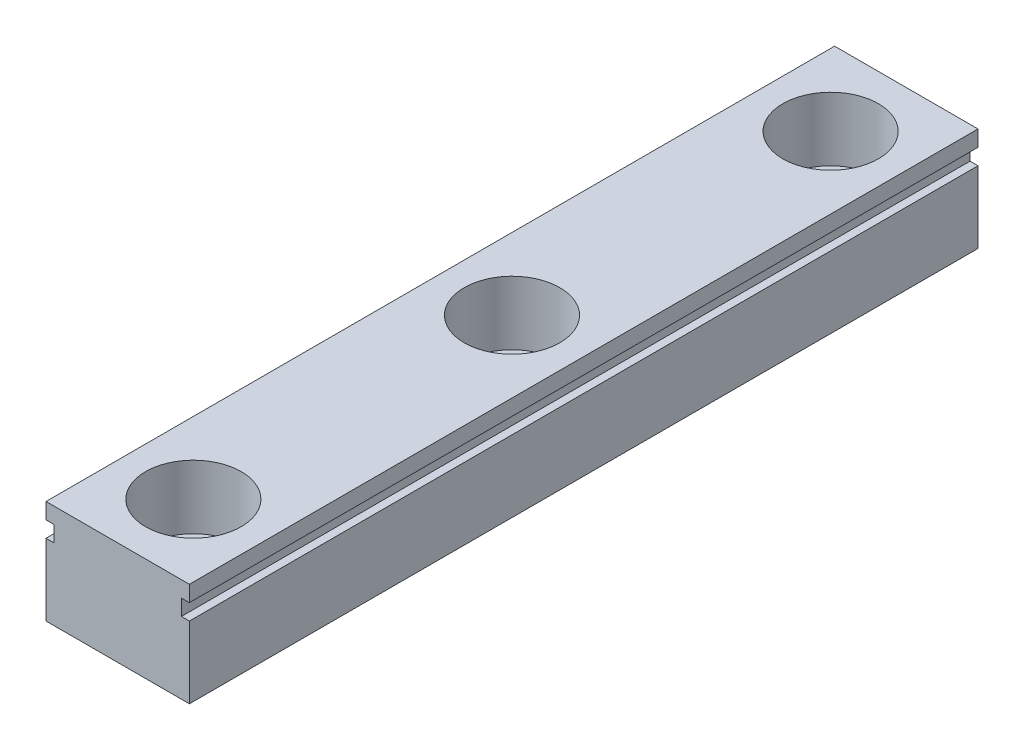
ISO-10303-21;
HEADER;
FILE_DESCRIPTION(('STEP AP214'),'2;1');
FILE_NAME('part.step','',(''),(''),'','','');
FILE_SCHEMA(('AUTOMOTIVE_DESIGN { 1 0 10303 214 1 1 1 1 }'));
ENDSEC;
DATA;
#1=APPLICATION_CONTEXT('core data for automotive mechanical design processes');
#2=APPLICATION_PROTOCOL_DEFINITION('international standard','automotive_design',2000,#1);
#3=PRODUCT_CONTEXT('',#1,'mechanical');
#4=PRODUCT('Part','Part','',(#3));
#5=PRODUCT_RELATED_PRODUCT_CATEGORY('part','',(#4));
#6=PRODUCT_DEFINITION_FORMATION('','',#4);
#7=PRODUCT_DEFINITION_CONTEXT('part definition',#1,'design');
#8=PRODUCT_DEFINITION('design','',#6,#7);
#9=PRODUCT_DEFINITION_SHAPE('','',#8);
#10=(LENGTH_UNIT() NAMED_UNIT(*) SI_UNIT(.MILLI.,.METRE.));
#11=(NAMED_UNIT(*) PLANE_ANGLE_UNIT() SI_UNIT($,.RADIAN.));
#12=(NAMED_UNIT(*) SI_UNIT($,.STERADIAN.) SOLID_ANGLE_UNIT());
#13=UNCERTAINTY_MEASURE_WITH_UNIT(LENGTH_MEASURE(1.E-05),#10,'distance_accuracy_value','');
#14=(GEOMETRIC_REPRESENTATION_CONTEXT(3) GLOBAL_UNCERTAINTY_ASSIGNED_CONTEXT((#13)) GLOBAL_UNIT_ASSIGNED_CONTEXT((#10,
#11,#12)) REPRESENTATION_CONTEXT('',''));
#15=CARTESIAN_POINT('',(0.,0.,0.));
#16=DIRECTION('',(0.,0.,1.));
#17=DIRECTION('',(1.,0.,0.));
#18=AXIS2_PLACEMENT_3D('',#15,#16,#17);
#19=CARTESIAN_POINT('',(0.,6.5,0.));
#20=DIRECTION('',(1.,0.,0.));
#21=DIRECTION('',(0.,0.,-1.));
#22=AXIS2_PLACEMENT_3D('',#19,#20,#21);
#23=PLANE('',#22);
#24=DIRECTION('',(0.,-1.,0.));
#25=VECTOR('',#24,1.);
#26=CARTESIAN_POINT('',(0.,6.5,0.));
#27=LINE('',#26,#25);
#28=CARTESIAN_POINT('',(0.,6.5,0.));
#29=VERTEX_POINT('',#28);
#30=CARTESIAN_POINT('',(0.,5.5,0.));
#31=VERTEX_POINT('',#30);
#32=EDGE_CURVE('E147',#29,#31,#27,.T.);
#33=ORIENTED_EDGE('',*,*,#32,.T.);
#34=DIRECTION('',(0.,0.,1.));
#35=VECTOR('',#34,1.);
#36=CARTESIAN_POINT('',(0.,5.5,0.));
#37=LINE('',#36,#35);
#38=CARTESIAN_POINT('',(0.,5.5,49.5));
#39=VERTEX_POINT('',#38);
#40=EDGE_CURVE('E225',#31,#39,#37,.T.);
#41=ORIENTED_EDGE('',*,*,#40,.T.);
#42=DIRECTION('',(0.,-1.,0.));
#43=VECTOR('',#42,1.);
#44=CARTESIAN_POINT('',(0.,6.5,49.5));
#45=LINE('',#44,#43);
#46=CARTESIAN_POINT('',(0.,6.5,49.5));
#47=VERTEX_POINT('',#46);
#48=EDGE_CURVE('E11',#47,#39,#45,.T.);
#49=ORIENTED_EDGE('',*,*,#48,.F.);
#50=DIRECTION('',(0.,0.,1.));
#51=VECTOR('',#50,1.);
#52=CARTESIAN_POINT('',(0.,6.5,0.));
#53=LINE('',#52,#51);
#54=EDGE_CURVE('E188',#29,#47,#53,.T.);
#55=ORIENTED_EDGE('',*,*,#54,.F.);
#56=EDGE_LOOP('',(#33,#41,#49,#55));
#57=FACE_BOUND('',#56,.T.);
#58=ADVANCED_FACE('F35',(#57),#23,.F.);
#59=CARTESIAN_POINT('',(9.,6.5,0.));
#60=DIRECTION('',(-1.,0.,0.));
#61=DIRECTION('',(0.,0.,1.));
#62=AXIS2_PLACEMENT_3D('',#59,#60,#61);
#63=PLANE('',#62);
#64=DIRECTION('',(0.,-1.,0.));
#65=VECTOR('',#64,1.);
#66=CARTESIAN_POINT('',(9.,6.5,0.));
#67=LINE('',#66,#65);
#68=CARTESIAN_POINT('',(9.,4.5,0.));
#69=VERTEX_POINT('',#68);
#70=CARTESIAN_POINT('',(9.,0.,0.));
#71=VERTEX_POINT('',#70);
#72=EDGE_CURVE('E151',#69,#71,#67,.T.);
#73=ORIENTED_EDGE('',*,*,#72,.F.);
#74=DIRECTION('',(0.,0.,1.));
#75=VECTOR('',#74,1.);
#76=CARTESIAN_POINT('',(9.,4.5,0.));
#77=LINE('',#76,#75);
#78=CARTESIAN_POINT('',(9.,4.5,49.5));
#79=VERTEX_POINT('',#78);
#80=EDGE_CURVE('E216',#69,#79,#77,.T.);
#81=ORIENTED_EDGE('',*,*,#80,.T.);
#82=DIRECTION('',(0.,-1.,0.));
#83=VECTOR('',#82,1.);
#84=CARTESIAN_POINT('',(9.00000000000001,6.5,49.5));
#85=LINE('',#84,#83);
#86=CARTESIAN_POINT('',(9.00000000000001,0.,49.5));
#87=VERTEX_POINT('',#86);
#88=EDGE_CURVE('E160',#79,#87,#85,.T.);
#89=ORIENTED_EDGE('',*,*,#88,.T.);
#90=DIRECTION('',(0.,0.,-1.));
#91=VECTOR('',#90,1.);
#92=CARTESIAN_POINT('',(9.,0.,0.));
#93=LINE('',#92,#91);
#94=EDGE_CURVE('E197',#87,#71,#93,.T.);
#95=ORIENTED_EDGE('',*,*,#94,.T.);
#96=EDGE_LOOP('',(#73,#81,#89,#95));
#97=FACE_BOUND('',#96,.T.);
#98=ADVANCED_FACE('F202',(#97),#63,.F.);
#99=CARTESIAN_POINT('',(4.5,0.,24.75));
#100=DIRECTION('',(0.,1.,0.));
#101=DIRECTION('',(0.,0.,1.));
#102=AXIS2_PLACEMENT_3D('',#99,#100,#101);
#103=CYLINDRICAL_SURFACE('',#102,1.55);
#104=CARTESIAN_POINT('',(4.5,0.,24.75));
#105=DIRECTION('',(0.,1.,0.));
#106=DIRECTION('',(0.,0.,1.));
#107=AXIS2_PLACEMENT_3D('',#104,#105,#106);
#108=CIRCLE('',#107,1.55);
#109=CARTESIAN_POINT('',(4.5,0.,26.3));
#110=VERTEX_POINT('',#109);
#111=EDGE_CURVE('E181',#110,#110,#108,.T.);
#112=CARTESIAN_POINT('',(4.5,2.5,24.75));
#113=DIRECTION('',(0.,1.,0.));
#114=DIRECTION('',(0.,0.,1.));
#115=AXIS2_PLACEMENT_3D('',#112,#113,#114);
#116=CIRCLE('',#115,1.55);
#117=CARTESIAN_POINT('',(4.5,2.5,26.3));
#118=VERTEX_POINT('',#117);
#119=EDGE_CURVE('E39',#118,#118,#116,.F.);
#120=CARTESIAN_POINT('',(4.5,0.,26.3));
#121=CARTESIAN_POINT('',(4.5,0.0260416666666666,26.3));
#122=CARTESIAN_POINT('',(4.5,0.0520833333333333,26.3));
#123=CARTESIAN_POINT('',(4.5,0.104166666666667,26.3));
#124=CARTESIAN_POINT('',(4.5,0.130208333333333,26.3));
#125=CARTESIAN_POINT('',(4.5,0.182291666666667,26.3));
#126=CARTESIAN_POINT('',(4.5,0.208333333333333,26.3));
#127=CARTESIAN_POINT('',(4.5,0.260416666666667,26.3));
#128=CARTESIAN_POINT('',(4.5,0.286458333333333,26.3));
#129=CARTESIAN_POINT('',(4.5,0.338541666666667,26.3));
#130=CARTESIAN_POINT('',(4.5,0.364583333333333,26.3));
#131=CARTESIAN_POINT('',(4.5,0.416666666666667,26.3));
#132=CARTESIAN_POINT('',(4.5,0.442708333333333,26.3));
#133=CARTESIAN_POINT('',(4.5,0.494791666666667,26.3));
#134=CARTESIAN_POINT('',(4.5,0.520833333333333,26.3));
#135=CARTESIAN_POINT('',(4.5,0.572916666666666,26.3));
#136=CARTESIAN_POINT('',(4.5,0.598958333333333,26.3));
#137=CARTESIAN_POINT('',(4.5,0.651041666666666,26.3));
#138=CARTESIAN_POINT('',(4.5,0.677083333333333,26.3));
#139=CARTESIAN_POINT('',(4.5,0.729166666666666,26.3));
#140=CARTESIAN_POINT('',(4.5,0.755208333333333,26.3));
#141=CARTESIAN_POINT('',(4.5,0.807291666666666,26.3));
#142=CARTESIAN_POINT('',(4.5,0.833333333333333,26.3));
#143=CARTESIAN_POINT('',(4.5,0.885416666666666,26.3));
#144=CARTESIAN_POINT('',(4.5,0.911458333333333,26.3));
#145=CARTESIAN_POINT('',(4.5,0.963541666666666,26.3));
#146=CARTESIAN_POINT('',(4.5,0.989583333333333,26.3));
#147=CARTESIAN_POINT('',(4.5,1.04166666666667,26.3));
#148=CARTESIAN_POINT('',(4.5,1.06770833333333,26.3));
#149=CARTESIAN_POINT('',(4.5,1.11979166666667,26.3));
#150=CARTESIAN_POINT('',(4.5,1.14583333333333,26.3));
#151=CARTESIAN_POINT('',(4.5,1.19791666666667,26.3));
#152=CARTESIAN_POINT('',(4.5,1.22395833333333,26.3));
#153=CARTESIAN_POINT('',(4.5,1.27604166666667,26.3));
#154=CARTESIAN_POINT('',(4.5,1.30208333333333,26.3));
#155=CARTESIAN_POINT('',(4.5,1.35416666666667,26.3));
#156=CARTESIAN_POINT('',(4.5,1.38020833333333,26.3));
#157=CARTESIAN_POINT('',(4.5,1.43229166666667,26.3));
#158=CARTESIAN_POINT('',(4.5,1.45833333333333,26.3));
#159=CARTESIAN_POINT('',(4.5,1.51041666666667,26.3));
#160=CARTESIAN_POINT('',(4.5,1.53645833333333,26.3));
#161=CARTESIAN_POINT('',(4.5,1.58854166666667,26.3));
#162=CARTESIAN_POINT('',(4.5,1.61458333333333,26.3));
#163=CARTESIAN_POINT('',(4.5,1.66666666666667,26.3));
#164=CARTESIAN_POINT('',(4.5,1.69270833333333,26.3));
#165=CARTESIAN_POINT('',(4.5,1.74479166666667,26.3));
#166=CARTESIAN_POINT('',(4.5,1.77083333333333,26.3));
#167=CARTESIAN_POINT('',(4.5,1.82291666666667,26.3));
#168=CARTESIAN_POINT('',(4.5,1.84895833333333,26.3));
#169=CARTESIAN_POINT('',(4.5,1.90104166666667,26.3));
#170=CARTESIAN_POINT('',(4.5,1.92708333333333,26.3));
#171=CARTESIAN_POINT('',(4.5,1.97916666666667,26.3));
#172=CARTESIAN_POINT('',(4.5,2.00520833333333,26.3));
#173=CARTESIAN_POINT('',(4.5,2.05729166666667,26.3));
#174=CARTESIAN_POINT('',(4.5,2.08333333333333,26.3));
#175=CARTESIAN_POINT('',(4.5,2.13541666666667,26.3));
#176=CARTESIAN_POINT('',(4.5,2.16145833333333,26.3));
#177=CARTESIAN_POINT('',(4.5,2.21354166666667,26.3));
#178=CARTESIAN_POINT('',(4.5,2.23958333333333,26.3));
#179=CARTESIAN_POINT('',(4.5,2.29166666666667,26.3));
#180=CARTESIAN_POINT('',(4.5,2.31770833333333,26.3));
#181=CARTESIAN_POINT('',(4.5,2.36979166666667,26.3));
#182=CARTESIAN_POINT('',(4.5,2.39583333333333,26.3));
#183=CARTESIAN_POINT('',(4.5,2.44791666666667,26.3));
#184=CARTESIAN_POINT('',(4.5,2.47395833333333,26.3));
#185=CARTESIAN_POINT('',(4.5,2.5,26.3));
#186=B_SPLINE_CURVE_WITH_KNOTS('',3,(#120,#121,#122,#123,#124,#125,#126,#127,#128,#129,#130,
#131,#132,#133,#134,#135,#136,#137,#138,#139,#140,#141,#142,#143,#144,#145,#146,#147,#148,#149,
#150,#151,#152,#153,#154,#155,#156,#157,#158,#159,#160,#161,#162,#163,#164,#165,#166,#167,#168,
#169,#170,#171,#172,#173,#174,#175,#176,#177,#178,#179,#180,#181,#182,#183,#184,#185),
.UNSPECIFIED.,.F.,.F.,(4,2,2,2,2,2,2,2,2,2,2,2,2,2,2,2,2,2,2,2,2,2,2,2,2,2,2,2,2,2,2,2,4),(0.,
0.078125,0.15625,0.234375,0.3125,0.390625,0.46875,0.546875,0.625,0.703125,0.78125,0.859375,
0.9375,1.015625,1.09375,1.171875,1.25,1.328125,1.40625,1.484375,1.5625,1.640625,1.71875,
1.796875,1.875,1.953125,2.03125,2.109375,2.1875,2.265625,2.34375,2.421875,2.5),.UNSPECIFIED.);
#187=EDGE_CURVE('BSEAM306',#110,#118,#186,.T.);
#188=ORIENTED_EDGE('',*,*,#111,.F.);
#189=ORIENTED_EDGE('',*,*,#119,.F.);
#190=ORIENTED_EDGE('',*,*,#187,.T.);
#191=ORIENTED_EDGE('',*,*,#187,.F.);
#192=EDGE_LOOP('',(#188,#190,#189,#191));
#193=FACE_BOUND('',#192,.T.);
#194=ADVANCED_FACE('F306',(#193),#103,.F.);
#195=CARTESIAN_POINT('',(4.5,0.,4.75));
#196=DIRECTION('',(0.,1.,0.));
#197=DIRECTION('',(0.,0.,1.));
#198=AXIS2_PLACEMENT_3D('',#195,#196,#197);
#199=CYLINDRICAL_SURFACE('',#198,1.55);
#200=CARTESIAN_POINT('',(4.5,0.,4.75));
#201=DIRECTION('',(0.,1.,0.));
#202=DIRECTION('',(0.,0.,1.));
#203=AXIS2_PLACEMENT_3D('',#200,#201,#202);
#204=CIRCLE('',#203,1.55);
#205=CARTESIAN_POINT('',(4.5,0.,6.3));
#206=VERTEX_POINT('',#205);
#207=EDGE_CURVE('E176',#206,#206,#204,.T.);
#208=CARTESIAN_POINT('',(4.5,2.5,4.75));
#209=DIRECTION('',(0.,1.,0.));
#210=DIRECTION('',(0.,0.,1.));
#211=AXIS2_PLACEMENT_3D('',#208,#209,#210);
#212=CIRCLE('',#211,1.55);
#213=CARTESIAN_POINT('',(4.5,2.5,6.3));
#214=VERTEX_POINT('',#213);
#215=EDGE_CURVE('E166',#214,#214,#212,.F.);
#216=CARTESIAN_POINT('',(4.5,0.,6.3));
#217=CARTESIAN_POINT('',(4.5,0.0260416666666666,6.3));
#218=CARTESIAN_POINT('',(4.5,0.0520833333333333,6.3));
#219=CARTESIAN_POINT('',(4.5,0.104166666666667,6.3));
#220=CARTESIAN_POINT('',(4.5,0.130208333333333,6.3));
#221=CARTESIAN_POINT('',(4.5,0.182291666666667,6.3));
#222=CARTESIAN_POINT('',(4.5,0.208333333333333,6.3));
#223=CARTESIAN_POINT('',(4.5,0.260416666666667,6.3));
#224=CARTESIAN_POINT('',(4.5,0.286458333333333,6.3));
#225=CARTESIAN_POINT('',(4.5,0.338541666666667,6.3));
#226=CARTESIAN_POINT('',(4.5,0.364583333333333,6.3));
#227=CARTESIAN_POINT('',(4.5,0.416666666666667,6.3));
#228=CARTESIAN_POINT('',(4.5,0.442708333333333,6.3));
#229=CARTESIAN_POINT('',(4.5,0.494791666666667,6.3));
#230=CARTESIAN_POINT('',(4.5,0.520833333333333,6.3));
#231=CARTESIAN_POINT('',(4.5,0.572916666666666,6.3));
#232=CARTESIAN_POINT('',(4.5,0.598958333333333,6.3));
#233=CARTESIAN_POINT('',(4.5,0.651041666666666,6.3));
#234=CARTESIAN_POINT('',(4.5,0.677083333333333,6.3));
#235=CARTESIAN_POINT('',(4.5,0.729166666666666,6.3));
#236=CARTESIAN_POINT('',(4.5,0.755208333333333,6.3));
#237=CARTESIAN_POINT('',(4.5,0.807291666666666,6.3));
#238=CARTESIAN_POINT('',(4.5,0.833333333333333,6.3));
#239=CARTESIAN_POINT('',(4.5,0.885416666666666,6.3));
#240=CARTESIAN_POINT('',(4.5,0.911458333333333,6.3));
#241=CARTESIAN_POINT('',(4.5,0.963541666666666,6.3));
#242=CARTESIAN_POINT('',(4.5,0.989583333333333,6.3));
#243=CARTESIAN_POINT('',(4.5,1.04166666666667,6.3));
#244=CARTESIAN_POINT('',(4.5,1.06770833333333,6.3));
#245=CARTESIAN_POINT('',(4.5,1.11979166666667,6.3));
#246=CARTESIAN_POINT('',(4.5,1.14583333333333,6.3));
#247=CARTESIAN_POINT('',(4.5,1.19791666666667,6.3));
#248=CARTESIAN_POINT('',(4.5,1.22395833333333,6.3));
#249=CARTESIAN_POINT('',(4.5,1.27604166666667,6.3));
#250=CARTESIAN_POINT('',(4.5,1.30208333333333,6.3));
#251=CARTESIAN_POINT('',(4.5,1.35416666666667,6.3));
#252=CARTESIAN_POINT('',(4.5,1.38020833333333,6.3));
#253=CARTESIAN_POINT('',(4.5,1.43229166666667,6.3));
#254=CARTESIAN_POINT('',(4.5,1.45833333333333,6.3));
#255=CARTESIAN_POINT('',(4.5,1.51041666666667,6.3));
#256=CARTESIAN_POINT('',(4.5,1.53645833333333,6.3));
#257=CARTESIAN_POINT('',(4.5,1.58854166666667,6.3));
#258=CARTESIAN_POINT('',(4.5,1.61458333333333,6.3));
#259=CARTESIAN_POINT('',(4.5,1.66666666666667,6.3));
#260=CARTESIAN_POINT('',(4.5,1.69270833333333,6.3));
#261=CARTESIAN_POINT('',(4.5,1.74479166666667,6.3));
#262=CARTESIAN_POINT('',(4.5,1.77083333333333,6.3));
#263=CARTESIAN_POINT('',(4.5,1.82291666666667,6.3));
#264=CARTESIAN_POINT('',(4.5,1.84895833333333,6.3));
#265=CARTESIAN_POINT('',(4.5,1.90104166666667,6.3));
#266=CARTESIAN_POINT('',(4.5,1.92708333333333,6.3));
#267=CARTESIAN_POINT('',(4.5,1.97916666666667,6.3));
#268=CARTESIAN_POINT('',(4.5,2.00520833333333,6.3));
#269=CARTESIAN_POINT('',(4.5,2.05729166666667,6.3));
#270=CARTESIAN_POINT('',(4.5,2.08333333333333,6.3));
#271=CARTESIAN_POINT('',(4.5,2.13541666666667,6.3));
#272=CARTESIAN_POINT('',(4.5,2.16145833333333,6.3));
#273=CARTESIAN_POINT('',(4.5,2.21354166666667,6.3));
#274=CARTESIAN_POINT('',(4.5,2.23958333333333,6.3));
#275=CARTESIAN_POINT('',(4.5,2.29166666666667,6.3));
#276=CARTESIAN_POINT('',(4.5,2.31770833333333,6.3));
#277=CARTESIAN_POINT('',(4.5,2.36979166666667,6.3));
#278=CARTESIAN_POINT('',(4.5,2.39583333333333,6.3));
#279=CARTESIAN_POINT('',(4.5,2.44791666666667,6.3));
#280=CARTESIAN_POINT('',(4.5,2.47395833333333,6.3));
#281=CARTESIAN_POINT('',(4.5,2.5,6.3));
#282=B_SPLINE_CURVE_WITH_KNOTS('',3,(#216,#217,#218,#219,#220,#221,#222,#223,#224,#225,#226,
#227,#228,#229,#230,#231,#232,#233,#234,#235,#236,#237,#238,#239,#240,#241,#242,#243,#244,#245,
#246,#247,#248,#249,#250,#251,#252,#253,#254,#255,#256,#257,#258,#259,#260,#261,#262,#263,#264,
#265,#266,#267,#268,#269,#270,#271,#272,#273,#274,#275,#276,#277,#278,#279,#280,#281),
.UNSPECIFIED.,.F.,.F.,(4,2,2,2,2,2,2,2,2,2,2,2,2,2,2,2,2,2,2,2,2,2,2,2,2,2,2,2,2,2,2,2,4),(0.,
0.078125,0.15625,0.234375,0.3125,0.390625,0.46875,0.546875,0.625,0.703125,0.78125,0.859375,
0.9375,1.015625,1.09375,1.171875,1.25,1.328125,1.40625,1.484375,1.5625,1.640625,1.71875,
1.796875,1.875,1.953125,2.03125,2.109375,2.1875,2.265625,2.34375,2.421875,2.5),.UNSPECIFIED.);
#283=EDGE_CURVE('BSEAM314',#206,#214,#282,.T.);
#284=ORIENTED_EDGE('',*,*,#207,.F.);
#285=ORIENTED_EDGE('',*,*,#215,.F.);
#286=ORIENTED_EDGE('',*,*,#283,.T.);
#287=ORIENTED_EDGE('',*,*,#283,.F.);
#288=EDGE_LOOP('',(#284,#286,#285,#287));
#289=FACE_BOUND('',#288,.T.);
#290=ADVANCED_FACE('F314',(#289),#199,.F.);
#291=CARTESIAN_POINT('',(4.5,0.,44.75));
#292=DIRECTION('',(0.,1.,0.));
#293=DIRECTION('',(0.,0.,1.));
#294=AXIS2_PLACEMENT_3D('',#291,#292,#293);
#295=CYLINDRICAL_SURFACE('',#294,1.55);
#296=CARTESIAN_POINT('',(4.5,0.,44.75));
#297=DIRECTION('',(0.,1.,0.));
#298=DIRECTION('',(0.,0.,1.));
#299=AXIS2_PLACEMENT_3D('',#296,#297,#298);
#300=CIRCLE('',#299,1.55);
#301=CARTESIAN_POINT('',(4.5,0.,46.3));
#302=VERTEX_POINT('',#301);
#303=EDGE_CURVE('E172',#302,#302,#300,.T.);
#304=CARTESIAN_POINT('',(4.5,2.5,44.75));
#305=DIRECTION('',(0.,1.,0.));
#306=DIRECTION('',(0.,0.,1.));
#307=AXIS2_PLACEMENT_3D('',#304,#305,#306);
#308=CIRCLE('',#307,1.55);
#309=CARTESIAN_POINT('',(4.5,2.5,46.3));
#310=VERTEX_POINT('',#309);
#311=EDGE_CURVE('E164',#310,#310,#308,.F.);
#312=CARTESIAN_POINT('',(4.5,0.,46.3));
#313=CARTESIAN_POINT('',(4.5,0.0260416666666666,46.3));
#314=CARTESIAN_POINT('',(4.5,0.0520833333333333,46.3));
#315=CARTESIAN_POINT('',(4.5,0.104166666666667,46.3));
#316=CARTESIAN_POINT('',(4.5,0.130208333333333,46.3));
#317=CARTESIAN_POINT('',(4.5,0.182291666666667,46.3));
#318=CARTESIAN_POINT('',(4.5,0.208333333333333,46.3));
#319=CARTESIAN_POINT('',(4.5,0.260416666666667,46.3));
#320=CARTESIAN_POINT('',(4.5,0.286458333333333,46.3));
#321=CARTESIAN_POINT('',(4.5,0.338541666666667,46.3));
#322=CARTESIAN_POINT('',(4.5,0.364583333333333,46.3));
#323=CARTESIAN_POINT('',(4.5,0.416666666666667,46.3));
#324=CARTESIAN_POINT('',(4.5,0.442708333333333,46.3));
#325=CARTESIAN_POINT('',(4.5,0.494791666666667,46.3));
#326=CARTESIAN_POINT('',(4.5,0.520833333333333,46.3));
#327=CARTESIAN_POINT('',(4.5,0.572916666666666,46.3));
#328=CARTESIAN_POINT('',(4.5,0.598958333333333,46.3));
#329=CARTESIAN_POINT('',(4.5,0.651041666666666,46.3));
#330=CARTESIAN_POINT('',(4.5,0.677083333333333,46.3));
#331=CARTESIAN_POINT('',(4.5,0.729166666666666,46.3));
#332=CARTESIAN_POINT('',(4.5,0.755208333333333,46.3));
#333=CARTESIAN_POINT('',(4.5,0.807291666666666,46.3));
#334=CARTESIAN_POINT('',(4.5,0.833333333333333,46.3));
#335=CARTESIAN_POINT('',(4.5,0.885416666666666,46.3));
#336=CARTESIAN_POINT('',(4.5,0.911458333333333,46.3));
#337=CARTESIAN_POINT('',(4.5,0.963541666666666,46.3));
#338=CARTESIAN_POINT('',(4.5,0.989583333333333,46.3));
#339=CARTESIAN_POINT('',(4.5,1.04166666666667,46.3));
#340=CARTESIAN_POINT('',(4.5,1.06770833333333,46.3));
#341=CARTESIAN_POINT('',(4.5,1.11979166666667,46.3));
#342=CARTESIAN_POINT('',(4.5,1.14583333333333,46.3));
#343=CARTESIAN_POINT('',(4.5,1.19791666666667,46.3));
#344=CARTESIAN_POINT('',(4.5,1.22395833333333,46.3));
#345=CARTESIAN_POINT('',(4.5,1.27604166666667,46.3));
#346=CARTESIAN_POINT('',(4.5,1.30208333333333,46.3));
#347=CARTESIAN_POINT('',(4.5,1.35416666666667,46.3));
#348=CARTESIAN_POINT('',(4.5,1.38020833333333,46.3));
#349=CARTESIAN_POINT('',(4.5,1.43229166666667,46.3));
#350=CARTESIAN_POINT('',(4.5,1.45833333333333,46.3));
#351=CARTESIAN_POINT('',(4.5,1.51041666666667,46.3));
#352=CARTESIAN_POINT('',(4.5,1.53645833333333,46.3));
#353=CARTESIAN_POINT('',(4.5,1.58854166666667,46.3));
#354=CARTESIAN_POINT('',(4.5,1.61458333333333,46.3));
#355=CARTESIAN_POINT('',(4.5,1.66666666666667,46.3));
#356=CARTESIAN_POINT('',(4.5,1.69270833333333,46.3));
#357=CARTESIAN_POINT('',(4.5,1.74479166666667,46.3));
#358=CARTESIAN_POINT('',(4.5,1.77083333333333,46.3));
#359=CARTESIAN_POINT('',(4.5,1.82291666666667,46.3));
#360=CARTESIAN_POINT('',(4.5,1.84895833333333,46.3));
#361=CARTESIAN_POINT('',(4.5,1.90104166666667,46.3));
#362=CARTESIAN_POINT('',(4.5,1.92708333333333,46.3));
#363=CARTESIAN_POINT('',(4.5,1.97916666666667,46.3));
#364=CARTESIAN_POINT('',(4.5,2.00520833333333,46.3));
#365=CARTESIAN_POINT('',(4.5,2.05729166666667,46.3));
#366=CARTESIAN_POINT('',(4.5,2.08333333333333,46.3));
#367=CARTESIAN_POINT('',(4.5,2.13541666666667,46.3));
#368=CARTESIAN_POINT('',(4.5,2.16145833333333,46.3));
#369=CARTESIAN_POINT('',(4.5,2.21354166666667,46.3));
#370=CARTESIAN_POINT('',(4.5,2.23958333333333,46.3));
#371=CARTESIAN_POINT('',(4.5,2.29166666666667,46.3));
#372=CARTESIAN_POINT('',(4.5,2.31770833333333,46.3));
#373=CARTESIAN_POINT('',(4.5,2.36979166666667,46.3));
#374=CARTESIAN_POINT('',(4.5,2.39583333333333,46.3));
#375=CARTESIAN_POINT('',(4.5,2.44791666666667,46.3));
#376=CARTESIAN_POINT('',(4.5,2.47395833333333,46.3));
#377=CARTESIAN_POINT('',(4.5,2.5,46.3));
#378=B_SPLINE_CURVE_WITH_KNOTS('',3,(#312,#313,#314,#315,#316,#317,#318,#319,#320,#321,#322,
#323,#324,#325,#326,#327,#328,#329,#330,#331,#332,#333,#334,#335,#336,#337,#338,#339,#340,#341,
#342,#343,#344,#345,#346,#347,#348,#349,#350,#351,#352,#353,#354,#355,#356,#357,#358,#359,#360,
#361,#362,#363,#364,#365,#366,#367,#368,#369,#370,#371,#372,#373,#374,#375,#376,#377),
.UNSPECIFIED.,.F.,.F.,(4,2,2,2,2,2,2,2,2,2,2,2,2,2,2,2,2,2,2,2,2,2,2,2,2,2,2,2,2,2,2,2,4),(0.,
0.078125,0.15625,0.234375,0.3125,0.390625,0.46875,0.546875,0.625,0.703125,0.78125,0.859375,
0.9375,1.015625,1.09375,1.171875,1.25,1.328125,1.40625,1.484375,1.5625,1.640625,1.71875,
1.796875,1.875,1.953125,2.03125,2.109375,2.1875,2.265625,2.34375,2.421875,2.5),.UNSPECIFIED.);
#379=EDGE_CURVE('BSEAM309',#302,#310,#378,.T.);
#380=ORIENTED_EDGE('',*,*,#303,.F.);
#381=ORIENTED_EDGE('',*,*,#311,.F.);
#382=ORIENTED_EDGE('',*,*,#379,.T.);
#383=ORIENTED_EDGE('',*,*,#379,.F.);
#384=EDGE_LOOP('',(#380,#382,#381,#383));
#385=FACE_BOUND('',#384,.T.);
#386=ADVANCED_FACE('F309',(#385),#295,.F.);
#387=CARTESIAN_POINT('',(0.,4.5,49.5));
#388=VERTEX_POINT('',#387);
#389=CARTESIAN_POINT('',(0.,0.,49.5));
#390=VERTEX_POINT('',#389);
#391=EDGE_CURVE('E44',#388,#390,#45,.T.);
#392=ORIENTED_EDGE('',*,*,#391,.F.);
#393=DIRECTION('',(0.,0.,1.));
#394=VECTOR('',#393,1.);
#395=CARTESIAN_POINT('',(0.,4.5,0.));
#396=LINE('',#395,#394);
#397=CARTESIAN_POINT('',(0.,4.5,0.));
#398=VERTEX_POINT('',#397);
#399=EDGE_CURVE('E129',#398,#388,#396,.T.);
#400=ORIENTED_EDGE('',*,*,#399,.F.);
#401=CARTESIAN_POINT('',(0.,0.,0.));
#402=VERTEX_POINT('',#401);
#403=EDGE_CURVE('E139',#398,#402,#27,.T.);
#404=ORIENTED_EDGE('',*,*,#403,.T.);
#405=DIRECTION('',(0.,0.,1.));
#406=VECTOR('',#405,1.);
#407=CARTESIAN_POINT('',(0.,0.,0.));
#408=LINE('',#407,#406);
#409=EDGE_CURVE('E187',#402,#390,#408,.T.);
#410=ORIENTED_EDGE('',*,*,#409,.T.);
#411=EDGE_LOOP('',(#392,#400,#404,#410));
#412=FACE_BOUND('',#411,.T.);
#413=ADVANCED_FACE('F37',(#412),#23,.F.);
#414=CARTESIAN_POINT('',(0.,6.5,49.5));
#415=DIRECTION('',(0.,0.,-1.));
#416=DIRECTION('',(-1.,0.,0.));
#417=AXIS2_PLACEMENT_3D('',#414,#415,#416);
#418=PLANE('',#417);
#419=ORIENTED_EDGE('',*,*,#48,.T.);
#420=DIRECTION('',(-1.,0.,0.));
#421=VECTOR('',#420,1.);
#422=CARTESIAN_POINT('',(0.,5.5,49.5));
#423=LINE('',#422,#421);
#424=CARTESIAN_POINT('',(0.500000000000006,5.5,49.5));
#425=VERTEX_POINT('',#424);
#426=EDGE_CURVE('E134',#425,#39,#423,.T.);
#427=ORIENTED_EDGE('',*,*,#426,.F.);
#428=DIRECTION('',(0.,1.,0.));
#429=VECTOR('',#428,1.);
#430=CARTESIAN_POINT('',(0.500000000000006,5.5,49.5));
#431=LINE('',#430,#429);
#432=CARTESIAN_POINT('',(0.500000000000006,4.5,49.5));
#433=VERTEX_POINT('',#432);
#434=EDGE_CURVE('E215',#433,#425,#431,.T.);
#435=ORIENTED_EDGE('',*,*,#434,.F.);
#436=DIRECTION('',(1.,0.,0.));
#437=VECTOR('',#436,1.);
#438=CARTESIAN_POINT('',(0.,4.5,49.5));
#439=LINE('',#438,#437);
#440=EDGE_CURVE('E212',#388,#433,#439,.T.);
#441=ORIENTED_EDGE('',*,*,#440,.F.);
#442=ORIENTED_EDGE('',*,*,#391,.T.);
#443=DIRECTION('',(1.,0.,0.));
#444=VECTOR('',#443,1.);
#445=CARTESIAN_POINT('',(0.,0.,49.5));
#446=LINE('',#445,#444);
#447=EDGE_CURVE('E195',#390,#87,#446,.T.);
#448=ORIENTED_EDGE('',*,*,#447,.T.);
#449=ORIENTED_EDGE('',*,*,#88,.F.);
#450=DIRECTION('',(1.,0.,0.));
#451=VECTOR('',#450,1.);
#452=CARTESIAN_POINT('',(9.,4.5,49.5));
#453=LINE('',#452,#451);
#454=CARTESIAN_POINT('',(8.5,4.5,49.5));
#455=VERTEX_POINT('',#454);
#456=EDGE_CURVE('E235',#455,#79,#453,.T.);
#457=ORIENTED_EDGE('',*,*,#456,.F.);
#458=DIRECTION('',(0.,-1.,0.));
#459=VECTOR('',#458,1.);
#460=CARTESIAN_POINT('',(8.5,5.5,49.5));
#461=LINE('',#460,#459);
#462=CARTESIAN_POINT('',(8.5,5.5,49.5));
#463=VERTEX_POINT('',#462);
#464=EDGE_CURVE('E244',#463,#455,#461,.T.);
#465=ORIENTED_EDGE('',*,*,#464,.F.);
#466=DIRECTION('',(-1.,0.,0.));
#467=VECTOR('',#466,1.);
#468=CARTESIAN_POINT('',(9.00000000000001,5.5,49.5));
#469=LINE('',#468,#467);
#470=CARTESIAN_POINT('',(9.00000000000001,5.5,49.5));
#471=VERTEX_POINT('',#470);
#472=EDGE_CURVE('E241',#471,#463,#469,.T.);
#473=ORIENTED_EDGE('',*,*,#472,.F.);
#474=CARTESIAN_POINT('',(9.00000000000001,6.5,49.5));
#475=VERTEX_POINT('',#474);
#476=EDGE_CURVE('E161',#475,#471,#85,.T.);
#477=ORIENTED_EDGE('',*,*,#476,.F.);
#478=DIRECTION('',(1.,0.,0.));
#479=VECTOR('',#478,1.);
#480=CARTESIAN_POINT('',(0.,6.5,49.5));
#481=LINE('',#480,#479);
#482=EDGE_CURVE('E191',#47,#475,#481,.T.);
#483=ORIENTED_EDGE('',*,*,#482,.F.);
#484=EDGE_LOOP('',(#419,#427,#435,#441,#442,#448,#449,#457,#465,#473,#477,#483));
#485=FACE_BOUND('',#484,.T.);
#486=ADVANCED_FACE('F209',(#485),#418,.F.);
#487=ORIENTED_EDGE('',*,*,#476,.T.);
#488=DIRECTION('',(0.,0.,1.));
#489=VECTOR('',#488,1.);
#490=CARTESIAN_POINT('',(9.00000000000001,5.5,0.));
#491=LINE('',#490,#489);
#492=CARTESIAN_POINT('',(9.00000000000001,5.5,0.));
#493=VERTEX_POINT('',#492);
#494=EDGE_CURVE('E240',#493,#471,#491,.T.);
#495=ORIENTED_EDGE('',*,*,#494,.F.);
#496=CARTESIAN_POINT('',(9.,6.5,0.));
#497=VERTEX_POINT('',#496);
#498=EDGE_CURVE('E157',#497,#493,#67,.T.);
#499=ORIENTED_EDGE('',*,*,#498,.F.);
#500=DIRECTION('',(0.,0.,-1.));
#501=VECTOR('',#500,1.);
#502=CARTESIAN_POINT('',(9.,6.5,0.));
#503=LINE('',#502,#501);
#504=EDGE_CURVE('E152',#475,#497,#503,.T.);
#505=ORIENTED_EDGE('',*,*,#504,.F.);
#506=EDGE_LOOP('',(#487,#495,#499,#505));
#507=FACE_BOUND('',#506,.T.);
#508=ADVANCED_FACE('F287',(#507),#63,.F.);
#509=CARTESIAN_POINT('',(0.,6.5,0.));
#510=DIRECTION('',(0.,0.,1.));
#511=DIRECTION('',(1.,0.,0.));
#512=AXIS2_PLACEMENT_3D('',#509,#510,#511);
#513=PLANE('',#512);
#514=DIRECTION('',(0.,1.,0.));
#515=VECTOR('',#514,1.);
#516=CARTESIAN_POINT('',(0.500000000000006,5.5,0.));
#517=LINE('',#516,#515);
#518=CARTESIAN_POINT('',(0.500000000000006,4.5,0.));
#519=VERTEX_POINT('',#518);
#520=CARTESIAN_POINT('',(0.500000000000006,5.5,0.));
#521=VERTEX_POINT('',#520);
#522=EDGE_CURVE('E52',#519,#521,#517,.T.);
#523=ORIENTED_EDGE('',*,*,#522,.T.);
#524=DIRECTION('',(-1.,0.,0.));
#525=VECTOR('',#524,1.);
#526=CARTESIAN_POINT('',(0.,5.5,0.));
#527=LINE('',#526,#525);
#528=EDGE_CURVE('E141',#521,#31,#527,.T.);
#529=ORIENTED_EDGE('',*,*,#528,.T.);
#530=ORIENTED_EDGE('',*,*,#32,.F.);
#531=DIRECTION('',(-1.,0.,0.));
#532=VECTOR('',#531,1.);
#533=CARTESIAN_POINT('',(0.,6.5,0.));
#534=LINE('',#533,#532);
#535=EDGE_CURVE('E148',#497,#29,#534,.T.);
#536=ORIENTED_EDGE('',*,*,#535,.F.);
#537=ORIENTED_EDGE('',*,*,#498,.T.);
#538=DIRECTION('',(-1.,0.,0.));
#539=VECTOR('',#538,1.);
#540=CARTESIAN_POINT('',(9.00000000000001,5.5,0.));
#541=LINE('',#540,#539);
#542=CARTESIAN_POINT('',(8.5,5.5,0.));
#543=VERTEX_POINT('',#542);
#544=EDGE_CURVE('E232',#493,#543,#541,.T.);
#545=ORIENTED_EDGE('',*,*,#544,.T.);
#546=DIRECTION('',(0.,-1.,0.));
#547=VECTOR('',#546,1.);
#548=CARTESIAN_POINT('',(8.5,5.5,0.));
#549=LINE('',#548,#547);
#550=CARTESIAN_POINT('',(8.5,4.5,0.));
#551=VERTEX_POINT('',#550);
#552=EDGE_CURVE('E60',#543,#551,#549,.T.);
#553=ORIENTED_EDGE('',*,*,#552,.T.);
#554=DIRECTION('',(1.,0.,0.));
#555=VECTOR('',#554,1.);
#556=CARTESIAN_POINT('',(9.,4.5,0.));
#557=LINE('',#556,#555);
#558=EDGE_CURVE('E237',#551,#69,#557,.T.);
#559=ORIENTED_EDGE('',*,*,#558,.T.);
#560=ORIENTED_EDGE('',*,*,#72,.T.);
#561=DIRECTION('',(-1.,0.,0.));
#562=VECTOR('',#561,1.);
#563=CARTESIAN_POINT('',(0.,0.,0.));
#564=LINE('',#563,#562);
#565=EDGE_CURVE('E145',#71,#402,#564,.T.);
#566=ORIENTED_EDGE('',*,*,#565,.T.);
#567=ORIENTED_EDGE('',*,*,#403,.F.);
#568=DIRECTION('',(1.,0.,0.));
#569=VECTOR('',#568,1.);
#570=CARTESIAN_POINT('',(0.,4.5,0.));
#571=LINE('',#570,#569);
#572=EDGE_CURVE('E125',#398,#519,#571,.T.);
#573=ORIENTED_EDGE('',*,*,#572,.T.);
#574=EDGE_LOOP('',(#523,#529,#530,#536,#537,#545,#553,#559,#560,#566,#567,#573));
#575=FACE_BOUND('',#574,.T.);
#576=ADVANCED_FACE('F143',(#575),#513,.F.);
#577=CARTESIAN_POINT('',(0.,6.5,0.));
#578=DIRECTION('',(0.,1.,0.));
#579=DIRECTION('',(0.,0.,1.));
#580=AXIS2_PLACEMENT_3D('',#577,#578,#579);
#581=PLANE('',#580);
#582=CARTESIAN_POINT('',(4.5,6.5,44.75));
#583=DIRECTION('',(0.,1.,0.));
#584=DIRECTION('',(0.,0.,1.));
#585=AXIS2_PLACEMENT_3D('',#582,#583,#584);
#586=CIRCLE('',#585,3.);
#587=CARTESIAN_POINT('',(4.5,6.5,47.75));
#588=VERTEX_POINT('',#587);
#589=EDGE_CURVE('E254',#588,#588,#586,.T.);
#590=ORIENTED_EDGE('',*,*,#589,.F.);
#591=EDGE_LOOP('',(#590));
#592=FACE_BOUND('',#591,.T.);
#593=CARTESIAN_POINT('',(4.5,6.5,24.75));
#594=DIRECTION('',(0.,1.,0.));
#595=DIRECTION('',(0.,0.,1.));
#596=AXIS2_PLACEMENT_3D('',#593,#594,#595);
#597=CIRCLE('',#596,3.);
#598=CARTESIAN_POINT('',(4.5,6.5,27.75));
#599=VERTEX_POINT('',#598);
#600=EDGE_CURVE('E260',#599,#599,#597,.T.);
#601=ORIENTED_EDGE('',*,*,#600,.F.);
#602=EDGE_LOOP('',(#601));
#603=FACE_BOUND('',#602,.T.);
#604=CARTESIAN_POINT('',(4.5,6.5,4.75));
#605=DIRECTION('',(0.,1.,0.));
#606=DIRECTION('',(0.,0.,1.));
#607=AXIS2_PLACEMENT_3D('',#604,#605,#606);
#608=CIRCLE('',#607,3.);
#609=CARTESIAN_POINT('',(4.5,6.5,7.75));
#610=VERTEX_POINT('',#609);
#611=EDGE_CURVE('E228',#610,#610,#608,.T.);
#612=ORIENTED_EDGE('',*,*,#611,.F.);
#613=EDGE_LOOP('',(#612));
#614=FACE_BOUND('',#613,.T.);
#615=ORIENTED_EDGE('',*,*,#54,.T.);
#616=ORIENTED_EDGE('',*,*,#482,.T.);
#617=ORIENTED_EDGE('',*,*,#504,.T.);
#618=ORIENTED_EDGE('',*,*,#535,.T.);
#619=EDGE_LOOP('',(#615,#616,#617,#618));
#620=FACE_BOUND('',#619,.T.);
#621=ADVANCED_FACE('F270',(#592,#603,#614,#620),#581,.T.);
#622=CARTESIAN_POINT('',(0.,0.,0.));
#623=DIRECTION('',(0.,1.,0.));
#624=DIRECTION('',(0.,0.,1.));
#625=AXIS2_PLACEMENT_3D('',#622,#623,#624);
#626=PLANE('',#625);
#627=ORIENTED_EDGE('',*,*,#303,.T.);
#628=EDGE_LOOP('',(#627));
#629=FACE_BOUND('',#628,.T.);
#630=ORIENTED_EDGE('',*,*,#207,.T.);
#631=EDGE_LOOP('',(#630));
#632=FACE_BOUND('',#631,.T.);
#633=ORIENTED_EDGE('',*,*,#111,.T.);
#634=EDGE_LOOP('',(#633));
#635=FACE_BOUND('',#634,.T.);
#636=ORIENTED_EDGE('',*,*,#409,.F.);
#637=ORIENTED_EDGE('',*,*,#565,.F.);
#638=ORIENTED_EDGE('',*,*,#94,.F.);
#639=ORIENTED_EDGE('',*,*,#447,.F.);
#640=EDGE_LOOP('',(#636,#637,#638,#639));
#641=FACE_BOUND('',#640,.T.);
#642=ADVANCED_FACE('F207',(#629,#632,#635,#641),#626,.F.);
#643=CARTESIAN_POINT('',(4.5,2.5,44.75));
#644=DIRECTION('',(0.,1.,0.));
#645=DIRECTION('',(0.,0.,1.));
#646=AXIS2_PLACEMENT_3D('',#643,#644,#645);
#647=PLANE('',#646);
#648=CARTESIAN_POINT('',(4.5,2.5,44.75));
#649=DIRECTION('',(0.,1.,0.));
#650=DIRECTION('',(0.,0.,1.));
#651=AXIS2_PLACEMENT_3D('',#648,#649,#650);
#652=CIRCLE('',#651,3.);
#653=CARTESIAN_POINT('',(4.5,2.5,47.75));
#654=VERTEX_POINT('',#653);
#655=EDGE_CURVE('E167',#654,#654,#652,.T.);
#656=ORIENTED_EDGE('',*,*,#655,.T.);
#657=EDGE_LOOP('',(#656));
#658=FACE_BOUND('',#657,.T.);
#659=ORIENTED_EDGE('',*,*,#311,.T.);
#660=EDGE_LOOP('',(#659));
#661=FACE_BOUND('',#660,.T.);
#662=ADVANCED_FACE('F330',(#658,#661),#647,.T.);
#663=CARTESIAN_POINT('',(4.5,2.5,44.75));
#664=DIRECTION('',(0.,1.,0.));
#665=DIRECTION('',(0.,0.,1.));
#666=AXIS2_PLACEMENT_3D('',#663,#664,#665);
#667=CYLINDRICAL_SURFACE('',#666,3.);
#668=ORIENTED_EDGE('',*,*,#655,.F.);
#669=EDGE_LOOP('',(#668));
#670=FACE_BOUND('',#669,.T.);
#671=ORIENTED_EDGE('',*,*,#589,.T.);
#672=EDGE_LOOP('',(#671));
#673=FACE_BOUND('',#672,.T.);
#674=ADVANCED_FACE('F357',(#670,#673),#667,.F.);
#675=CARTESIAN_POINT('',(4.5,2.5,4.75));
#676=DIRECTION('',(0.,1.,0.));
#677=DIRECTION('',(0.,0.,1.));
#678=AXIS2_PLACEMENT_3D('',#675,#676,#677);
#679=PLANE('',#678);
#680=CARTESIAN_POINT('',(4.5,2.5,4.75));
#681=DIRECTION('',(0.,1.,0.));
#682=DIRECTION('',(0.,0.,1.));
#683=AXIS2_PLACEMENT_3D('',#680,#681,#682);
#684=CIRCLE('',#683,3.);
#685=CARTESIAN_POINT('',(4.5,2.5,7.75));
#686=VERTEX_POINT('',#685);
#687=EDGE_CURVE('E263',#686,#686,#684,.T.);
#688=ORIENTED_EDGE('',*,*,#687,.T.);
#689=EDGE_LOOP('',(#688));
#690=FACE_BOUND('',#689,.T.);
#691=ORIENTED_EDGE('',*,*,#215,.T.);
#692=EDGE_LOOP('',(#691));
#693=FACE_BOUND('',#692,.T.);
#694=ADVANCED_FACE('F365',(#690,#693),#679,.T.);
#695=CARTESIAN_POINT('',(4.5,2.5,4.75));
#696=DIRECTION('',(0.,1.,0.));
#697=DIRECTION('',(0.,0.,1.));
#698=AXIS2_PLACEMENT_3D('',#695,#696,#697);
#699=CYLINDRICAL_SURFACE('',#698,3.);
#700=ORIENTED_EDGE('',*,*,#687,.F.);
#701=EDGE_LOOP('',(#700));
#702=FACE_BOUND('',#701,.T.);
#703=ORIENTED_EDGE('',*,*,#611,.T.);
#704=EDGE_LOOP('',(#703));
#705=FACE_BOUND('',#704,.T.);
#706=ADVANCED_FACE('F268',(#702,#705),#699,.F.);
#707=CARTESIAN_POINT('',(4.5,2.5,24.75));
#708=DIRECTION('',(0.,1.,0.));
#709=DIRECTION('',(0.,0.,1.));
#710=AXIS2_PLACEMENT_3D('',#707,#708,#709);
#711=PLANE('',#710);
#712=CARTESIAN_POINT('',(4.5,2.5,24.75));
#713=DIRECTION('',(0.,1.,0.));
#714=DIRECTION('',(0.,0.,1.));
#715=AXIS2_PLACEMENT_3D('',#712,#713,#714);
#716=CIRCLE('',#715,3.);
#717=CARTESIAN_POINT('',(4.5,2.5,27.75));
#718=VERTEX_POINT('',#717);
#719=EDGE_CURVE('E257',#718,#718,#716,.T.);
#720=ORIENTED_EDGE('',*,*,#719,.T.);
#721=EDGE_LOOP('',(#720));
#722=FACE_BOUND('',#721,.T.);
#723=ORIENTED_EDGE('',*,*,#119,.T.);
#724=EDGE_LOOP('',(#723));
#725=FACE_BOUND('',#724,.T.);
#726=ADVANCED_FACE('F380',(#722,#725),#711,.T.);
#727=CARTESIAN_POINT('',(4.5,2.5,24.75));
#728=DIRECTION('',(0.,1.,0.));
#729=DIRECTION('',(0.,0.,1.));
#730=AXIS2_PLACEMENT_3D('',#727,#728,#729);
#731=CYLINDRICAL_SURFACE('',#730,3.);
#732=ORIENTED_EDGE('',*,*,#719,.F.);
#733=EDGE_LOOP('',(#732));
#734=FACE_BOUND('',#733,.T.);
#735=ORIENTED_EDGE('',*,*,#600,.T.);
#736=EDGE_LOOP('',(#735));
#737=FACE_BOUND('',#736,.T.);
#738=ADVANCED_FACE('F387',(#734,#737),#731,.F.);
#739=CARTESIAN_POINT('',(9.,4.5,0.));
#740=DIRECTION('',(0.,-1.,0.));
#741=DIRECTION('',(0.,0.,-1.));
#742=AXIS2_PLACEMENT_3D('',#739,#740,#741);
#743=PLANE('',#742);
#744=ORIENTED_EDGE('',*,*,#456,.T.);
#745=ORIENTED_EDGE('',*,*,#80,.F.);
#746=ORIENTED_EDGE('',*,*,#558,.F.);
#747=DIRECTION('',(0.,0.,1.));
#748=VECTOR('',#747,1.);
#749=CARTESIAN_POINT('',(8.5,4.5,0.));
#750=LINE('',#749,#748);
#751=EDGE_CURVE('E219',#551,#455,#750,.T.);
#752=ORIENTED_EDGE('',*,*,#751,.T.);
#753=EDGE_LOOP('',(#744,#745,#746,#752));
#754=FACE_BOUND('',#753,.T.);
#755=ADVANCED_FACE('F395',(#754),#743,.F.);
#756=CARTESIAN_POINT('',(8.5,5.5,0.));
#757=DIRECTION('',(-1.,0.,0.));
#758=DIRECTION('',(0.,0.,1.));
#759=AXIS2_PLACEMENT_3D('',#756,#757,#758);
#760=PLANE('',#759);
#761=ORIENTED_EDGE('',*,*,#464,.T.);
#762=ORIENTED_EDGE('',*,*,#751,.F.);
#763=ORIENTED_EDGE('',*,*,#552,.F.);
#764=DIRECTION('',(0.,0.,1.));
#765=VECTOR('',#764,1.);
#766=CARTESIAN_POINT('',(8.5,5.5,0.));
#767=LINE('',#766,#765);
#768=EDGE_CURVE('E249',#543,#463,#767,.T.);
#769=ORIENTED_EDGE('',*,*,#768,.T.);
#770=EDGE_LOOP('',(#761,#762,#763,#769));
#771=FACE_BOUND('',#770,.T.);
#772=ADVANCED_FACE('F402',(#771),#760,.F.);
#773=CARTESIAN_POINT('',(9.00000000000001,5.5,0.));
#774=DIRECTION('',(0.,1.,0.));
#775=DIRECTION('',(0.,0.,1.));
#776=AXIS2_PLACEMENT_3D('',#773,#774,#775);
#777=PLANE('',#776);
#778=ORIENTED_EDGE('',*,*,#472,.T.);
#779=ORIENTED_EDGE('',*,*,#768,.F.);
#780=ORIENTED_EDGE('',*,*,#544,.F.);
#781=ORIENTED_EDGE('',*,*,#494,.T.);
#782=EDGE_LOOP('',(#778,#779,#780,#781));
#783=FACE_BOUND('',#782,.T.);
#784=ADVANCED_FACE('F300',(#783),#777,.F.);
#785=CARTESIAN_POINT('',(0.,5.5,0.));
#786=DIRECTION('',(0.,1.,0.));
#787=DIRECTION('',(0.,0.,1.));
#788=AXIS2_PLACEMENT_3D('',#785,#786,#787);
#789=PLANE('',#788);
#790=ORIENTED_EDGE('',*,*,#426,.T.);
#791=ORIENTED_EDGE('',*,*,#40,.F.);
#792=ORIENTED_EDGE('',*,*,#528,.F.);
#793=DIRECTION('',(0.,0.,1.));
#794=VECTOR('',#793,1.);
#795=CARTESIAN_POINT('',(0.500000000000006,5.5,0.));
#796=LINE('',#795,#794);
#797=EDGE_CURVE('E229',#521,#425,#796,.T.);
#798=ORIENTED_EDGE('',*,*,#797,.T.);
#799=EDGE_LOOP('',(#790,#791,#792,#798));
#800=FACE_BOUND('',#799,.T.);
#801=ADVANCED_FACE('F291',(#800),#789,.F.);
#802=CARTESIAN_POINT('',(0.500000000000006,5.5,0.));
#803=DIRECTION('',(1.,0.,0.));
#804=DIRECTION('',(0.,1.,0.));
#805=AXIS2_PLACEMENT_3D('',#802,#803,#804);
#806=PLANE('',#805);
#807=ORIENTED_EDGE('',*,*,#434,.T.);
#808=ORIENTED_EDGE('',*,*,#797,.F.);
#809=ORIENTED_EDGE('',*,*,#522,.F.);
#810=DIRECTION('',(0.,0.,1.));
#811=VECTOR('',#810,1.);
#812=CARTESIAN_POINT('',(0.500000000000006,4.5,0.));
#813=LINE('',#812,#811);
#814=EDGE_CURVE('E131',#519,#433,#813,.T.);
#815=ORIENTED_EDGE('',*,*,#814,.T.);
#816=EDGE_LOOP('',(#807,#808,#809,#815));
#817=FACE_BOUND('',#816,.T.);
#818=ADVANCED_FACE('F292',(#817),#806,.F.);
#819=CARTESIAN_POINT('',(0.,4.5,0.));
#820=DIRECTION('',(0.,-1.,0.));
#821=DIRECTION('',(0.,0.,-1.));
#822=AXIS2_PLACEMENT_3D('',#819,#820,#821);
#823=PLANE('',#822);
#824=ORIENTED_EDGE('',*,*,#440,.T.);
#825=ORIENTED_EDGE('',*,*,#814,.F.);
#826=ORIENTED_EDGE('',*,*,#572,.F.);
#827=ORIENTED_EDGE('',*,*,#399,.T.);
#828=EDGE_LOOP('',(#824,#825,#826,#827));
#829=FACE_BOUND('',#828,.T.);
#830=ADVANCED_FACE('F128',(#829),#823,.F.);
#831=CLOSED_SHELL('',(#58,#98,#194,#290,#386,#413,#486,#508,#576,#621,#642,#662,#674,#694,#706,
#726,#738,#755,#772,#784,#801,#818,#830));
#832=MANIFOLD_SOLID_BREP('B2',#831);
#833=ADVANCED_BREP_SHAPE_REPRESENTATION('',(#18,#832),#14);
#834=SHAPE_DEFINITION_REPRESENTATION(#9,#833);
ENDSEC;
END-ISO-10303-21;
